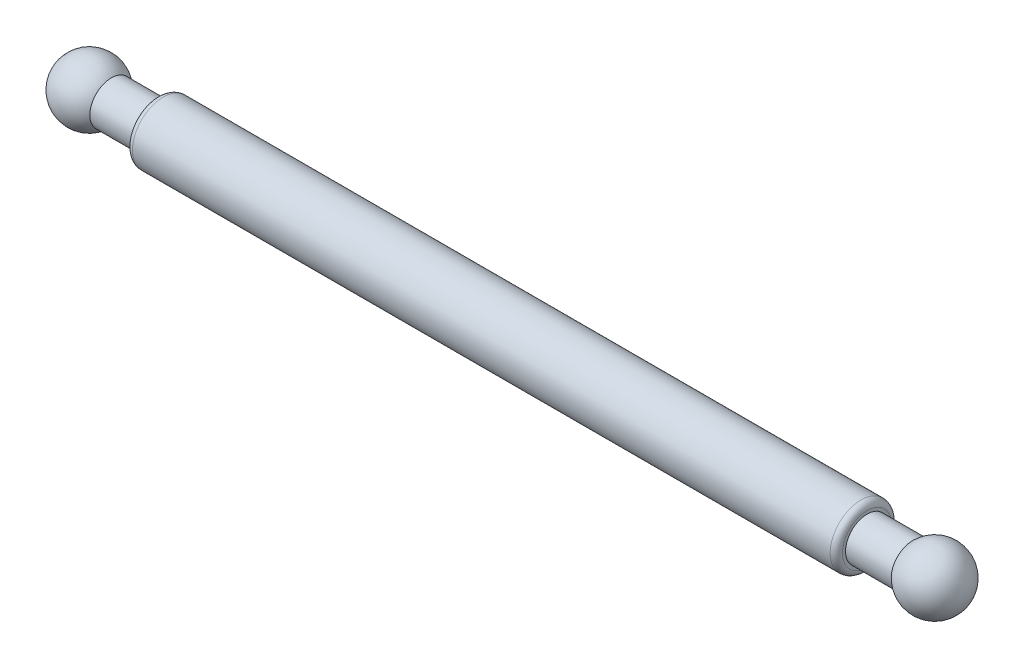
ISO-10303-21;
HEADER;
FILE_DESCRIPTION(('STEP AP214'),'2;1');
FILE_NAME('part.step','',(''),(''),'','','');
FILE_SCHEMA(('AUTOMOTIVE_DESIGN { 1 0 10303 214 1 1 1 1 }'));
ENDSEC;
DATA;
#1=APPLICATION_CONTEXT('core data for automotive mechanical design processes');
#2=APPLICATION_PROTOCOL_DEFINITION('international standard','automotive_design',2000,#1);
#3=PRODUCT_CONTEXT('',#1,'mechanical');
#4=PRODUCT('Part','Part','',(#3));
#5=PRODUCT_RELATED_PRODUCT_CATEGORY('part','',(#4));
#6=PRODUCT_DEFINITION_FORMATION('','',#4);
#7=PRODUCT_DEFINITION_CONTEXT('part definition',#1,'design');
#8=PRODUCT_DEFINITION('design','',#6,#7);
#9=PRODUCT_DEFINITION_SHAPE('','',#8);
#10=(LENGTH_UNIT() NAMED_UNIT(*) SI_UNIT(.MILLI.,.METRE.));
#11=(NAMED_UNIT(*) PLANE_ANGLE_UNIT() SI_UNIT($,.RADIAN.));
#12=(NAMED_UNIT(*) SI_UNIT($,.STERADIAN.) SOLID_ANGLE_UNIT());
#13=UNCERTAINTY_MEASURE_WITH_UNIT(LENGTH_MEASURE(1.E-05),#10,'distance_accuracy_value','');
#14=(GEOMETRIC_REPRESENTATION_CONTEXT(3) GLOBAL_UNCERTAINTY_ASSIGNED_CONTEXT((#13)) GLOBAL_UNIT_ASSIGNED_CONTEXT((#10,
#11,#12)) REPRESENTATION_CONTEXT('',''));
#15=CARTESIAN_POINT('',(0.,0.,0.));
#16=DIRECTION('',(0.,0.,1.));
#17=DIRECTION('',(1.,0.,0.));
#18=AXIS2_PLACEMENT_3D('',#15,#16,#17);
#19=CARTESIAN_POINT('',(68.75,0.,0.));
#20=DIRECTION('',(-1.,0.,0.));
#21=DIRECTION('',(0.,0.,1.));
#22=AXIS2_PLACEMENT_3D('',#19,#20,#21);
#23=CYLINDRICAL_SURFACE('',#22,3.5);
#24=CARTESIAN_POINT('',(3.57071421427143,0.,0.));
#25=DIRECTION('',(-1.,0.,0.));
#26=DIRECTION('',(0.,0.,1.));
#27=AXIS2_PLACEMENT_3D('',#24,#25,#26);
#28=CIRCLE('',#27,3.5);
#29=CARTESIAN_POINT('',(3.57071421427143,0.,3.5));
#30=VERTEX_POINT('',#29);
#31=EDGE_CURVE('E46',#30,#30,#28,.F.);
#32=ORIENTED_EDGE('',*,*,#31,.T.);
#33=EDGE_LOOP('',(#32));
#34=FACE_BOUND('',#33,.T.);
#35=CARTESIAN_POINT('',(11.,0.,0.));
#36=DIRECTION('',(1.,0.,0.));
#37=DIRECTION('',(0.,0.,-1.));
#38=AXIS2_PLACEMENT_3D('',#35,#36,#37);
#39=CIRCLE('',#38,3.5);
#40=CARTESIAN_POINT('',(11.,0.,-3.5));
#41=VERTEX_POINT('',#40);
#42=EDGE_CURVE('E42',#41,#41,#39,.T.);
#43=ORIENTED_EDGE('',*,*,#42,.F.);
#44=EDGE_LOOP('',(#43));
#45=FACE_BOUND('',#44,.T.);
#46=ADVANCED_FACE('F31',(#34,#45),#23,.T.);
#47=CARTESIAN_POINT('',(0.,0.,0.));
#48=DIRECTION('',(0.,0.,-1.));
#49=DIRECTION('',(1.,0.,0.));
#50=AXIS2_PLACEMENT_3D('',#47,#48,#49);
#51=SPHERICAL_SURFACE('',#50,5.);
#52=CARTESIAN_POINT('',(0.,0.,0.));
#53=DIRECTION('',(-1.,0.,0.));
#54=DIRECTION('',(0.,0.,1.));
#55=AXIS2_PLACEMENT_3D('',#52,#53,#54);
#56=SPHERICAL_SURFACE('',#55,5.);
#57=ORIENTED_EDGE('',*,*,#31,.F.);
#58=EDGE_LOOP('',(#57));
#59=FACE_BOUND('',#58,.T.);
#60=ADVANCED_FACE('F86',(#59),#56,.T.);
#61=CARTESIAN_POINT('',(11.,0.,0.));
#62=DIRECTION('',(1.,0.,0.));
#63=DIRECTION('',(0.,0.,-1.));
#64=AXIS2_PLACEMENT_3D('',#61,#62,#63);
#65=CYLINDRICAL_SURFACE('',#64,5.);
#66=CARTESIAN_POINT('',(12.,0.,0.));
#67=DIRECTION('',(1.,0.,0.));
#68=DIRECTION('',(0.,0.,-1.));
#69=AXIS2_PLACEMENT_3D('',#66,#67,#68);
#70=CIRCLE('',#69,5.);
#71=CARTESIAN_POINT('',(12.,0.,-5.));
#72=VERTEX_POINT('',#71);
#73=EDGE_CURVE('E38',#72,#72,#70,.T.);
#74=CARTESIAN_POINT('',(125.5,0.,0.));
#75=DIRECTION('',(1.,0.,0.));
#76=DIRECTION('',(0.,0.,-1.));
#77=AXIS2_PLACEMENT_3D('',#74,#75,#76);
#78=CIRCLE('',#77,5.);
#79=CARTESIAN_POINT('',(125.5,0.,-5.));
#80=VERTEX_POINT('',#79);
#81=EDGE_CURVE('E54',#80,#80,#78,.T.);
#82=CARTESIAN_POINT('',(12.,0.,-5.));
#83=CARTESIAN_POINT('',(13.1822916666667,0.,-5.));
#84=CARTESIAN_POINT('',(14.3645833333333,0.,-5.));
#85=CARTESIAN_POINT('',(16.7291666666667,0.,-5.));
#86=CARTESIAN_POINT('',(17.9114583333333,0.,-5.));
#87=CARTESIAN_POINT('',(20.2760416666667,0.,-5.));
#88=CARTESIAN_POINT('',(21.4583333333333,0.,-5.));
#89=CARTESIAN_POINT('',(23.8229166666667,0.,-5.));
#90=CARTESIAN_POINT('',(25.0052083333333,0.,-5.));
#91=CARTESIAN_POINT('',(27.3697916666667,0.,-5.));
#92=CARTESIAN_POINT('',(28.5520833333333,0.,-5.));
#93=CARTESIAN_POINT('',(30.9166666666667,0.,-5.));
#94=CARTESIAN_POINT('',(32.0989583333333,0.,-5.));
#95=CARTESIAN_POINT('',(34.4635416666667,0.,-5.));
#96=CARTESIAN_POINT('',(35.6458333333333,0.,-5.));
#97=CARTESIAN_POINT('',(38.0104166666667,0.,-5.));
#98=CARTESIAN_POINT('',(39.1927083333333,0.,-5.));
#99=CARTESIAN_POINT('',(41.5572916666667,0.,-5.));
#100=CARTESIAN_POINT('',(42.7395833333333,0.,-5.));
#101=CARTESIAN_POINT('',(45.1041666666667,0.,-5.));
#102=CARTESIAN_POINT('',(46.2864583333333,0.,-5.));
#103=CARTESIAN_POINT('',(48.6510416666667,0.,-5.));
#104=CARTESIAN_POINT('',(49.8333333333333,0.,-5.));
#105=CARTESIAN_POINT('',(52.1979166666667,0.,-5.));
#106=CARTESIAN_POINT('',(53.3802083333333,0.,-5.));
#107=CARTESIAN_POINT('',(55.7447916666667,0.,-5.));
#108=CARTESIAN_POINT('',(56.9270833333333,0.,-5.));
#109=CARTESIAN_POINT('',(59.2916666666667,0.,-5.));
#110=CARTESIAN_POINT('',(60.4739583333333,0.,-5.));
#111=CARTESIAN_POINT('',(62.8385416666667,0.,-5.));
#112=CARTESIAN_POINT('',(64.0208333333333,0.,-5.));
#113=CARTESIAN_POINT('',(66.3854166666667,0.,-5.));
#114=CARTESIAN_POINT('',(67.5677083333333,0.,-5.));
#115=CARTESIAN_POINT('',(69.9322916666667,0.,-5.));
#116=CARTESIAN_POINT('',(71.1145833333333,0.,-5.));
#117=CARTESIAN_POINT('',(73.4791666666667,0.,-5.));
#118=CARTESIAN_POINT('',(74.6614583333333,0.,-5.));
#119=CARTESIAN_POINT('',(77.0260416666667,0.,-5.));
#120=CARTESIAN_POINT('',(78.2083333333333,0.,-5.));
#121=CARTESIAN_POINT('',(80.5729166666667,0.,-5.));
#122=CARTESIAN_POINT('',(81.7552083333333,0.,-5.));
#123=CARTESIAN_POINT('',(84.1197916666667,0.,-5.));
#124=CARTESIAN_POINT('',(85.3020833333333,0.,-5.));
#125=CARTESIAN_POINT('',(87.6666666666667,0.,-5.));
#126=CARTESIAN_POINT('',(88.8489583333333,0.,-5.));
#127=CARTESIAN_POINT('',(91.2135416666667,0.,-5.));
#128=CARTESIAN_POINT('',(92.3958333333333,0.,-5.));
#129=CARTESIAN_POINT('',(94.7604166666667,0.,-5.));
#130=CARTESIAN_POINT('',(95.9427083333333,0.,-5.));
#131=CARTESIAN_POINT('',(98.3072916666667,0.,-5.));
#132=CARTESIAN_POINT('',(99.4895833333333,0.,-5.));
#133=CARTESIAN_POINT('',(101.854166666667,0.,-5.));
#134=CARTESIAN_POINT('',(103.036458333333,0.,-5.));
#135=CARTESIAN_POINT('',(105.401041666667,0.,-5.));
#136=CARTESIAN_POINT('',(106.583333333333,0.,-5.));
#137=CARTESIAN_POINT('',(108.947916666667,0.,-5.));
#138=CARTESIAN_POINT('',(110.130208333333,0.,-5.));
#139=CARTESIAN_POINT('',(112.494791666667,0.,-5.));
#140=CARTESIAN_POINT('',(113.677083333333,0.,-5.));
#141=CARTESIAN_POINT('',(116.041666666667,0.,-5.));
#142=CARTESIAN_POINT('',(117.223958333333,0.,-5.));
#143=CARTESIAN_POINT('',(119.588541666667,0.,-5.));
#144=CARTESIAN_POINT('',(120.770833333333,0.,-5.));
#145=CARTESIAN_POINT('',(123.135416666667,0.,-5.));
#146=CARTESIAN_POINT('',(124.317708333333,0.,-5.));
#147=CARTESIAN_POINT('',(125.5,0.,-5.));
#148=B_SPLINE_CURVE_WITH_KNOTS('',3,(#82,#83,#84,#85,#86,#87,#88,#89,#90,#91,#92,#93,#94,#95,
#96,#97,#98,#99,#100,#101,#102,#103,#104,#105,#106,#107,#108,#109,#110,#111,#112,#113,#114,#115,
#116,#117,#118,#119,#120,#121,#122,#123,#124,#125,#126,#127,#128,#129,#130,#131,#132,#133,#134,
#135,#136,#137,#138,#139,#140,#141,#142,#143,#144,#145,#146,#147),.UNSPECIFIED.,.F.,.F.,(4,2,2,
2,2,2,2,2,2,2,2,2,2,2,2,2,2,2,2,2,2,2,2,2,2,2,2,2,2,2,2,2,4),(0.,3.546875,7.09375,10.640625,
14.1875,17.734375,21.28125,24.828125,28.375,31.921875,35.46875,39.015625,42.5625,46.109375,
49.65625,53.203125,56.75,60.296875,63.84375,67.390625,70.9375,74.484375,78.03125,81.578125,
85.125,88.671875,92.21875,95.765625,99.3125,102.859375,106.40625,109.953125,113.5),.UNSPECIFIED.);
#149=EDGE_CURVE('BSEAM92',#72,#80,#148,.T.);
#150=ORIENTED_EDGE('',*,*,#73,.T.);
#151=ORIENTED_EDGE('',*,*,#81,.F.);
#152=ORIENTED_EDGE('',*,*,#149,.T.);
#153=ORIENTED_EDGE('',*,*,#149,.F.);
#154=EDGE_LOOP('',(#150,#152,#151,#153));
#155=FACE_BOUND('',#154,.T.);
#156=ADVANCED_FACE('F92',(#155),#65,.T.);
#157=CARTESIAN_POINT('',(11.,0.,0.));
#158=DIRECTION('',(1.,0.,0.));
#159=DIRECTION('',(0.,0.,-1.));
#160=AXIS2_PLACEMENT_3D('',#157,#158,#159);
#161=PLANE('',#160);
#162=CARTESIAN_POINT('',(11.,0.,0.));
#163=DIRECTION('',(1.,0.,0.));
#164=DIRECTION('',(0.,0.,-1.));
#165=AXIS2_PLACEMENT_3D('',#162,#163,#164);
#166=CIRCLE('',#165,4.);
#167=CARTESIAN_POINT('',(11.,0.,-4.));
#168=VERTEX_POINT('',#167);
#169=EDGE_CURVE('E10',#168,#168,#166,.F.);
#170=ORIENTED_EDGE('',*,*,#169,.T.);
#171=EDGE_LOOP('',(#170));
#172=FACE_BOUND('',#171,.T.);
#173=ORIENTED_EDGE('',*,*,#42,.T.);
#174=EDGE_LOOP('',(#173));
#175=FACE_BOUND('',#174,.T.);
#176=ADVANCED_FACE('F98',(#172,#175),#161,.F.);
#177=CARTESIAN_POINT('',(12.,0.,0.));
#178=DIRECTION('',(1.,0.,0.));
#179=DIRECTION('',(0.,0.,-1.));
#180=AXIS2_PLACEMENT_3D('',#177,#178,#179);
#181=TOROIDAL_SURFACE('',#180,4.,1.);
#182=ORIENTED_EDGE('',*,*,#169,.F.);
#183=EDGE_LOOP('',(#182));
#184=FACE_BOUND('',#183,.T.);
#185=ORIENTED_EDGE('',*,*,#73,.F.);
#186=EDGE_LOOP('',(#185));
#187=FACE_BOUND('',#186,.T.);
#188=ADVANCED_FACE('F33',(#184,#187),#181,.T.);
#189=CARTESIAN_POINT('',(68.75,0.,0.));
#190=DIRECTION('',(1.,0.,0.));
#191=DIRECTION('',(0.,0.,1.));
#192=AXIS2_PLACEMENT_3D('',#189,#190,#191);
#193=CYLINDRICAL_SURFACE('',#192,3.5);
#194=CARTESIAN_POINT('',(133.929285785729,0.,0.));
#195=DIRECTION('',(-1.,0.,0.));
#196=DIRECTION('',(0.,0.,1.));
#197=AXIS2_PLACEMENT_3D('',#194,#195,#196);
#198=CIRCLE('',#197,3.5);
#199=CARTESIAN_POINT('',(133.929285785729,0.,3.5));
#200=VERTEX_POINT('',#199);
#201=EDGE_CURVE('E60',#200,#200,#198,.F.);
#202=ORIENTED_EDGE('',*,*,#201,.F.);
#203=EDGE_LOOP('',(#202));
#204=FACE_BOUND('',#203,.T.);
#205=CARTESIAN_POINT('',(126.5,0.,0.));
#206=DIRECTION('',(1.,0.,0.));
#207=DIRECTION('',(0.,0.,-1.));
#208=AXIS2_PLACEMENT_3D('',#205,#206,#207);
#209=CIRCLE('',#208,3.5);
#210=CARTESIAN_POINT('',(126.5,0.,-3.5));
#211=VERTEX_POINT('',#210);
#212=EDGE_CURVE('E57',#211,#211,#209,.T.);
#213=ORIENTED_EDGE('',*,*,#212,.T.);
#214=EDGE_LOOP('',(#213));
#215=FACE_BOUND('',#214,.T.);
#216=ADVANCED_FACE('F66',(#204,#215),#193,.T.);
#217=CARTESIAN_POINT('',(137.5,0.,0.));
#218=DIRECTION('',(0.,0.,-1.));
#219=DIRECTION('',(-1.,0.,0.));
#220=AXIS2_PLACEMENT_3D('',#217,#218,#219);
#221=SPHERICAL_SURFACE('',#220,5.);
#222=CARTESIAN_POINT('',(137.5,0.,0.));
#223=DIRECTION('',(-1.,0.,0.));
#224=DIRECTION('',(0.,0.,1.));
#225=AXIS2_PLACEMENT_3D('',#222,#223,#224);
#226=SPHERICAL_SURFACE('',#225,5.);
#227=ORIENTED_EDGE('',*,*,#201,.T.);
#228=EDGE_LOOP('',(#227));
#229=FACE_BOUND('',#228,.T.);
#230=ADVANCED_FACE('F64',(#229),#226,.T.);
#231=CARTESIAN_POINT('',(126.5,0.,0.));
#232=DIRECTION('',(-1.,0.,0.));
#233=DIRECTION('',(0.,0.,-1.));
#234=AXIS2_PLACEMENT_3D('',#231,#232,#233);
#235=PLANE('',#234);
#236=CARTESIAN_POINT('',(126.5,0.,0.));
#237=DIRECTION('',(1.,0.,0.));
#238=DIRECTION('',(0.,0.,-1.));
#239=AXIS2_PLACEMENT_3D('',#236,#237,#238);
#240=CIRCLE('',#239,4.);
#241=CARTESIAN_POINT('',(126.5,0.,-4.));
#242=VERTEX_POINT('',#241);
#243=EDGE_CURVE('E51',#242,#242,#240,.F.);
#244=ORIENTED_EDGE('',*,*,#243,.F.);
#245=EDGE_LOOP('',(#244));
#246=FACE_BOUND('',#245,.T.);
#247=ORIENTED_EDGE('',*,*,#212,.F.);
#248=EDGE_LOOP('',(#247));
#249=FACE_BOUND('',#248,.T.);
#250=ADVANCED_FACE('F72',(#246,#249),#235,.F.);
#251=CARTESIAN_POINT('',(125.5,0.,0.));
#252=DIRECTION('',(-1.,0.,0.));
#253=DIRECTION('',(0.,0.,-1.));
#254=AXIS2_PLACEMENT_3D('',#251,#252,#253);
#255=TOROIDAL_SURFACE('',#254,4.,1.);
#256=ORIENTED_EDGE('',*,*,#243,.T.);
#257=EDGE_LOOP('',(#256));
#258=FACE_BOUND('',#257,.T.);
#259=ORIENTED_EDGE('',*,*,#81,.T.);
#260=EDGE_LOOP('',(#259));
#261=FACE_BOUND('',#260,.T.);
#262=ADVANCED_FACE('F74',(#258,#261),#255,.T.);
#263=CLOSED_SHELL('',(#46,#60,#156,#176,#188,#216,#230,#250,#262));
#264=MANIFOLD_SOLID_BREP('B2',#263);
#265=ADVANCED_BREP_SHAPE_REPRESENTATION('',(#18,#264),#14);
#266=SHAPE_DEFINITION_REPRESENTATION(#9,#265);
ENDSEC;
END-ISO-10303-21;
